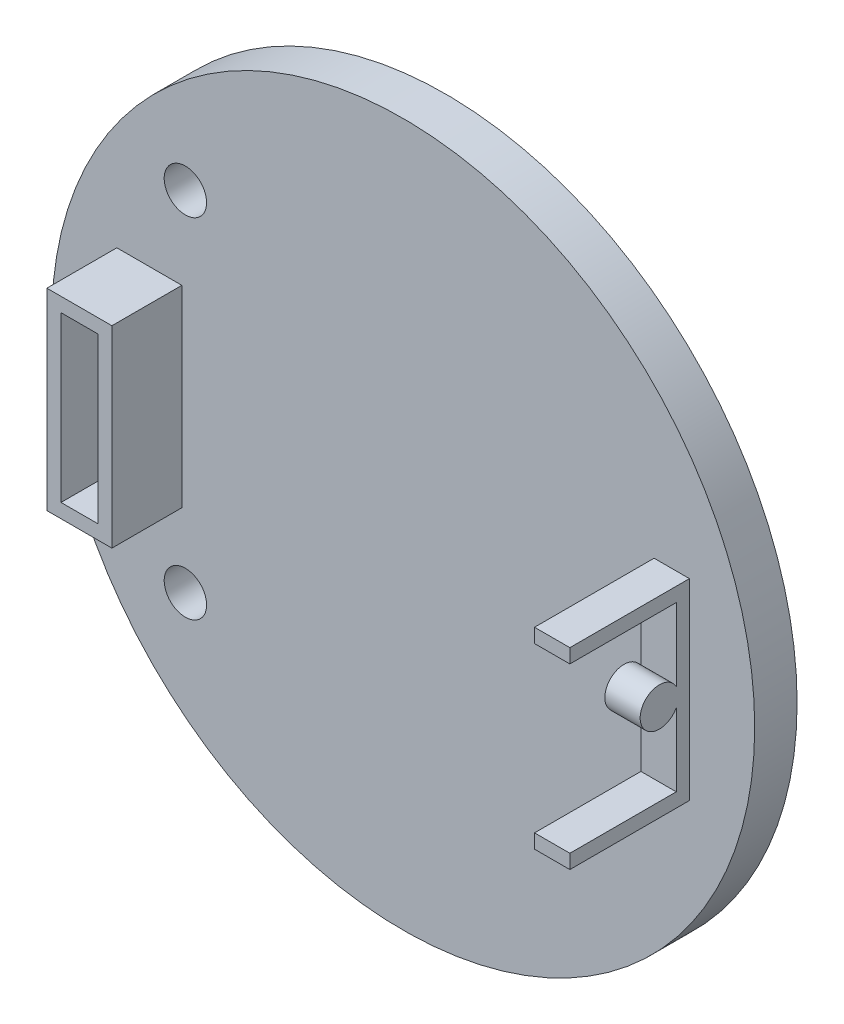
ISO-10303-21;
HEADER;
FILE_DESCRIPTION(('STEP AP214'),'2;1');
FILE_NAME('part.step','',(''),(''),'','','');
FILE_SCHEMA(('AUTOMOTIVE_DESIGN { 1 0 10303 214 1 1 1 1 }'));
ENDSEC;
DATA;
#1=APPLICATION_CONTEXT('core data for automotive mechanical design processes');
#2=APPLICATION_PROTOCOL_DEFINITION('international standard','automotive_design',2000,#1);
#3=PRODUCT_CONTEXT('',#1,'mechanical');
#4=PRODUCT('Part','Part','',(#3));
#5=PRODUCT_RELATED_PRODUCT_CATEGORY('part','',(#4));
#6=PRODUCT_DEFINITION_FORMATION('','',#4);
#7=PRODUCT_DEFINITION_CONTEXT('part definition',#1,'design');
#8=PRODUCT_DEFINITION('design','',#6,#7);
#9=PRODUCT_DEFINITION_SHAPE('','',#8);
#10=(LENGTH_UNIT() NAMED_UNIT(*) SI_UNIT(.MILLI.,.METRE.));
#11=(NAMED_UNIT(*) PLANE_ANGLE_UNIT() SI_UNIT($,.RADIAN.));
#12=(NAMED_UNIT(*) SI_UNIT($,.STERADIAN.) SOLID_ANGLE_UNIT());
#13=UNCERTAINTY_MEASURE_WITH_UNIT(LENGTH_MEASURE(1.E-05),#10,'distance_accuracy_value','');
#14=(GEOMETRIC_REPRESENTATION_CONTEXT(3) GLOBAL_UNCERTAINTY_ASSIGNED_CONTEXT((#13)) GLOBAL_UNIT_ASSIGNED_CONTEXT((#10,
#11,#12)) REPRESENTATION_CONTEXT('',''));
#15=CARTESIAN_POINT('',(0.,0.,0.));
#16=DIRECTION('',(0.,0.,1.));
#17=DIRECTION('',(1.,0.,0.));
#18=AXIS2_PLACEMENT_3D('',#15,#16,#17);
#19=CARTESIAN_POINT('',(0.,0.,0.));
#20=DIRECTION('',(0.,0.,1.));
#21=DIRECTION('',(1.,0.,0.));
#22=AXIS2_PLACEMENT_3D('',#19,#20,#21);
#23=PLANE('',#22);
#24=CARTESIAN_POINT('',(-15.4092069314207,12.7514449398056,0.));
#25=DIRECTION('',(0.,0.,1.));
#26=DIRECTION('',(1.,0.,0.));
#27=AXIS2_PLACEMENT_3D('',#24,#25,#26);
#28=CIRCLE('',#27,1.5);
#29=CARTESIAN_POINT('',(-13.9092069314207,12.7514449398056,0.));
#30=VERTEX_POINT('',#29);
#31=EDGE_CURVE('E358',#30,#30,#28,.T.);
#32=ORIENTED_EDGE('',*,*,#31,.F.);
#33=EDGE_LOOP('',(#32));
#34=FACE_BOUND('',#33,.T.);
#35=CARTESIAN_POINT('',(-15.4092069314207,-11.8993191986614,0.));
#36=DIRECTION('',(0.,0.,1.));
#37=DIRECTION('',(1.,0.,0.));
#38=AXIS2_PLACEMENT_3D('',#35,#36,#37);
#39=CIRCLE('',#38,1.5);
#40=CARTESIAN_POINT('',(-13.9092069314207,-11.8993191986614,0.));
#41=VERTEX_POINT('',#40);
#42=EDGE_CURVE('E365',#41,#41,#39,.T.);
#43=ORIENTED_EDGE('',*,*,#42,.F.);
#44=EDGE_LOOP('',(#43));
#45=FACE_BOUND('',#44,.T.);
#46=DIRECTION('',(1.,0.,0.));
#47=VECTOR('',#46,1.);
#48=CARTESIAN_POINT('',(17.755,6.8,0.));
#49=LINE('',#48,#47);
#50=CARTESIAN_POINT('',(17.755,6.8,0.));
#51=VERTEX_POINT('',#50);
#52=CARTESIAN_POINT('',(20.255,6.8,0.));
#53=VERTEX_POINT('',#52);
#54=EDGE_CURVE('E305',#51,#53,#49,.T.);
#55=ORIENTED_EDGE('',*,*,#54,.T.);
#56=DIRECTION('',(0.,-1.,0.));
#57=VECTOR('',#56,1.);
#58=CARTESIAN_POINT('',(20.255,6.8,0.));
#59=LINE('',#58,#57);
#60=CARTESIAN_POINT('',(20.255,-6.8,0.));
#61=VERTEX_POINT('',#60);
#62=EDGE_CURVE('E328',#53,#61,#59,.T.);
#63=ORIENTED_EDGE('',*,*,#62,.T.);
#64=DIRECTION('',(1.,0.,0.));
#65=VECTOR('',#64,1.);
#66=CARTESIAN_POINT('',(17.755,-6.8,0.));
#67=LINE('',#66,#65);
#68=CARTESIAN_POINT('',(17.755,-6.8,0.));
#69=VERTEX_POINT('',#68);
#70=EDGE_CURVE('E331',#69,#61,#67,.T.);
#71=ORIENTED_EDGE('',*,*,#70,.F.);
#72=DIRECTION('',(0.,-1.,0.));
#73=VECTOR('',#72,1.);
#74=CARTESIAN_POINT('',(17.755,6.8,0.));
#75=LINE('',#74,#73);
#76=EDGE_CURVE('E311',#51,#69,#75,.T.);
#77=ORIENTED_EDGE('',*,*,#76,.F.);
#78=EDGE_LOOP('',(#55,#63,#71,#77));
#79=FACE_BOUND('',#78,.T.);
#80=CARTESIAN_POINT('',(0.,0.,0.));
#81=DIRECTION('',(0.,0.,1.));
#82=DIRECTION('',(1.,0.,0.));
#83=AXIS2_PLACEMENT_3D('',#80,#81,#82);
#84=CIRCLE('',#83,24.875);
#85=CARTESIAN_POINT('',(24.875,0.,0.));
#86=VERTEX_POINT('',#85);
#87=EDGE_CURVE('E49',#86,#86,#84,.T.);
#88=ORIENTED_EDGE('',*,*,#87,.T.);
#89=EDGE_LOOP('',(#88));
#90=FACE_BOUND('',#89,.T.);
#91=DIRECTION('',(1.,0.,0.));
#92=VECTOR('',#91,1.);
#93=CARTESIAN_POINT('',(-20.26,-6.815,0.));
#94=LINE('',#93,#92);
#95=CARTESIAN_POINT('',(-20.26,-6.815,0.));
#96=VERTEX_POINT('',#95);
#97=CARTESIAN_POINT('',(-15.66,-6.815,0.));
#98=VERTEX_POINT('',#97);
#99=EDGE_CURVE('E225',#96,#98,#94,.T.);
#100=ORIENTED_EDGE('',*,*,#99,.F.);
#101=DIRECTION('',(0.,-1.,0.));
#102=VECTOR('',#101,1.);
#103=CARTESIAN_POINT('',(-20.26,6.815,0.));
#104=LINE('',#103,#102);
#105=CARTESIAN_POINT('',(-20.26,6.815,0.));
#106=VERTEX_POINT('',#105);
#107=EDGE_CURVE('E205',#106,#96,#104,.T.);
#108=ORIENTED_EDGE('',*,*,#107,.F.);
#109=DIRECTION('',(-1.,0.,0.));
#110=VECTOR('',#109,1.);
#111=CARTESIAN_POINT('',(-20.26,6.815,0.));
#112=LINE('',#111,#110);
#113=CARTESIAN_POINT('',(-15.66,6.815,0.));
#114=VERTEX_POINT('',#113);
#115=EDGE_CURVE('E212',#114,#106,#112,.T.);
#116=ORIENTED_EDGE('',*,*,#115,.F.);
#117=DIRECTION('',(0.,1.,0.));
#118=VECTOR('',#117,1.);
#119=CARTESIAN_POINT('',(-15.66,6.815,0.));
#120=LINE('',#119,#118);
#121=EDGE_CURVE('E228',#98,#114,#120,.T.);
#122=ORIENTED_EDGE('',*,*,#121,.F.);
#123=EDGE_LOOP('',(#100,#108,#116,#122));
#124=FACE_BOUND('',#123,.T.);
#125=ADVANCED_FACE('F39',(#34,#45,#79,#90,#124),#23,.T.);
#126=CARTESIAN_POINT('',(0.,0.,8.46));
#127=DIRECTION('',(0.,0.,-1.));
#128=DIRECTION('',(-1.,0.,0.));
#129=AXIS2_PLACEMENT_3D('',#126,#127,#128);
#130=PLANE('',#129);
#131=DIRECTION('',(1.,0.,0.));
#132=VECTOR('',#131,1.);
#133=CARTESIAN_POINT('',(3.92599913973473,-5.8,8.46));
#134=LINE('',#133,#132);
#135=CARTESIAN_POINT('',(17.755,-5.8,8.46));
#136=VERTEX_POINT('',#135);
#137=CARTESIAN_POINT('',(20.255,-5.8,8.46));
#138=VERTEX_POINT('',#137);
#139=EDGE_CURVE('E288',#136,#138,#134,.T.);
#140=ORIENTED_EDGE('',*,*,#139,.F.);
#141=DIRECTION('',(0.,-1.,0.));
#142=VECTOR('',#141,1.);
#143=CARTESIAN_POINT('',(17.755,6.8,8.46));
#144=LINE('',#143,#142);
#145=CARTESIAN_POINT('',(17.755,-6.8,8.46));
#146=VERTEX_POINT('',#145);
#147=EDGE_CURVE('E320',#136,#146,#144,.T.);
#148=ORIENTED_EDGE('',*,*,#147,.T.);
#149=DIRECTION('',(1.,0.,0.));
#150=VECTOR('',#149,1.);
#151=CARTESIAN_POINT('',(17.755,-6.8,8.46));
#152=LINE('',#151,#150);
#153=CARTESIAN_POINT('',(20.255,-6.8,8.46));
#154=VERTEX_POINT('',#153);
#155=EDGE_CURVE('E316',#146,#154,#152,.T.);
#156=ORIENTED_EDGE('',*,*,#155,.T.);
#157=DIRECTION('',(0.,-1.,0.));
#158=VECTOR('',#157,1.);
#159=CARTESIAN_POINT('',(20.255,6.8,8.46));
#160=LINE('',#159,#158);
#161=EDGE_CURVE('E310',#138,#154,#160,.T.);
#162=ORIENTED_EDGE('',*,*,#161,.F.);
#163=EDGE_LOOP('',(#140,#148,#156,#162));
#164=FACE_BOUND('',#163,.T.);
#165=ADVANCED_FACE('F402',(#164),#130,.F.);
#166=DIRECTION('',(1.,0.,0.));
#167=VECTOR('',#166,1.);
#168=CARTESIAN_POINT('',(3.92599913973473,5.8,8.46));
#169=LINE('',#168,#167);
#170=CARTESIAN_POINT('',(17.755,5.8,8.46));
#171=VERTEX_POINT('',#170);
#172=CARTESIAN_POINT('',(20.255,5.8,8.46));
#173=VERTEX_POINT('',#172);
#174=EDGE_CURVE('E291',#171,#173,#169,.T.);
#175=ORIENTED_EDGE('',*,*,#174,.T.);
#176=CARTESIAN_POINT('',(20.255,6.8,8.46));
#177=VERTEX_POINT('',#176);
#178=EDGE_CURVE('E312',#177,#173,#160,.T.);
#179=ORIENTED_EDGE('',*,*,#178,.F.);
#180=DIRECTION('',(1.,0.,0.));
#181=VECTOR('',#180,1.);
#182=CARTESIAN_POINT('',(17.755,6.8,8.46));
#183=LINE('',#182,#181);
#184=CARTESIAN_POINT('',(17.755,6.8,8.46));
#185=VERTEX_POINT('',#184);
#186=EDGE_CURVE('E306',#185,#177,#183,.T.);
#187=ORIENTED_EDGE('',*,*,#186,.F.);
#188=EDGE_CURVE('E321',#185,#171,#144,.T.);
#189=ORIENTED_EDGE('',*,*,#188,.T.);
#190=EDGE_LOOP('',(#175,#179,#187,#189));
#191=FACE_BOUND('',#190,.T.);
#192=ADVANCED_FACE('F397',(#191),#130,.F.);
#193=CARTESIAN_POINT('',(0.,0.,-3.));
#194=DIRECTION('',(0.,0.,1.));
#195=DIRECTION('',(1.,0.,0.));
#196=AXIS2_PLACEMENT_3D('',#193,#194,#195);
#197=CYLINDRICAL_SURFACE('',#196,24.875);
#198=CARTESIAN_POINT('',(0.,0.,-3.));
#199=DIRECTION('',(0.,0.,1.));
#200=DIRECTION('',(1.,0.,0.));
#201=AXIS2_PLACEMENT_3D('',#198,#199,#200);
#202=CIRCLE('',#201,24.875);
#203=CARTESIAN_POINT('',(24.875,0.,-3.));
#204=VERTEX_POINT('',#203);
#205=EDGE_CURVE('E11',#204,#204,#202,.T.);
#206=ORIENTED_EDGE('',*,*,#205,.T.);
#207=EDGE_LOOP('',(#206));
#208=FACE_BOUND('',#207,.T.);
#209=ORIENTED_EDGE('',*,*,#87,.F.);
#210=EDGE_LOOP('',(#209));
#211=FACE_BOUND('',#210,.T.);
#212=ADVANCED_FACE('F41',(#208,#211),#197,.T.);
#213=CARTESIAN_POINT('',(0.,0.,-3.));
#214=DIRECTION('',(0.,0.,1.));
#215=DIRECTION('',(1.,0.,0.));
#216=AXIS2_PLACEMENT_3D('',#213,#214,#215);
#217=PLANE('',#216);
#218=CARTESIAN_POINT('',(-15.4092069314207,12.7514449398056,-3.));
#219=DIRECTION('',(0.,0.,1.));
#220=DIRECTION('',(1.,0.,0.));
#221=AXIS2_PLACEMENT_3D('',#218,#219,#220);
#222=CIRCLE('',#221,1.5);
#223=CARTESIAN_POINT('',(-13.9092069314207,12.7514449398056,-3.));
#224=VERTEX_POINT('',#223);
#225=EDGE_CURVE('E43',#224,#224,#222,.T.);
#226=ORIENTED_EDGE('',*,*,#225,.T.);
#227=EDGE_LOOP('',(#226));
#228=FACE_BOUND('',#227,.T.);
#229=CARTESIAN_POINT('',(-15.4092069314207,-11.8993191986614,-3.));
#230=DIRECTION('',(0.,0.,1.));
#231=DIRECTION('',(1.,0.,0.));
#232=AXIS2_PLACEMENT_3D('',#229,#230,#231);
#233=CIRCLE('',#232,1.5);
#234=CARTESIAN_POINT('',(-13.9092069314207,-11.8993191986614,-3.));
#235=VERTEX_POINT('',#234);
#236=EDGE_CURVE('E355',#235,#235,#233,.T.);
#237=ORIENTED_EDGE('',*,*,#236,.T.);
#238=EDGE_LOOP('',(#237));
#239=FACE_BOUND('',#238,.T.);
#240=DIRECTION('',(1.,0.,0.));
#241=VECTOR('',#240,1.);
#242=CARTESIAN_POINT('',(-19.26,5.815,-3.));
#243=LINE('',#242,#241);
#244=CARTESIAN_POINT('',(-19.26,5.815,-3.));
#245=VERTEX_POINT('',#244);
#246=CARTESIAN_POINT('',(-16.66,5.815,-3.));
#247=VERTEX_POINT('',#246);
#248=EDGE_CURVE('E375',#245,#247,#243,.T.);
#249=ORIENTED_EDGE('',*,*,#248,.F.);
#250=DIRECTION('',(0.,1.,0.));
#251=VECTOR('',#250,1.);
#252=CARTESIAN_POINT('',(-19.26,5.815,-3.));
#253=LINE('',#252,#251);
#254=CARTESIAN_POINT('',(-19.26,-5.815,-3.));
#255=VERTEX_POINT('',#254);
#256=EDGE_CURVE('E206',#255,#245,#253,.T.);
#257=ORIENTED_EDGE('',*,*,#256,.F.);
#258=DIRECTION('',(-1.,0.,0.));
#259=VECTOR('',#258,1.);
#260=CARTESIAN_POINT('',(-19.26,-5.815,-3.));
#261=LINE('',#260,#259);
#262=CARTESIAN_POINT('',(-16.66,-5.815,-3.));
#263=VERTEX_POINT('',#262);
#264=EDGE_CURVE('E202',#263,#255,#261,.T.);
#265=ORIENTED_EDGE('',*,*,#264,.F.);
#266=DIRECTION('',(0.,-1.,0.));
#267=VECTOR('',#266,1.);
#268=CARTESIAN_POINT('',(-16.66,5.815,-3.));
#269=LINE('',#268,#267);
#270=EDGE_CURVE('E173',#247,#263,#269,.T.);
#271=ORIENTED_EDGE('',*,*,#270,.F.);
#272=EDGE_LOOP('',(#249,#257,#265,#271));
#273=FACE_BOUND('',#272,.T.);
#274=ORIENTED_EDGE('',*,*,#205,.F.);
#275=EDGE_LOOP('',(#274));
#276=FACE_BOUND('',#275,.T.);
#277=ADVANCED_FACE('F387',(#228,#239,#273,#276),#217,.F.);
#278=CARTESIAN_POINT('',(17.755,6.8,8.46));
#279=DIRECTION('',(0.,1.,0.));
#280=DIRECTION('',(-1.,0.,0.));
#281=AXIS2_PLACEMENT_3D('',#278,#279,#280);
#282=PLANE('',#281);
#283=ORIENTED_EDGE('',*,*,#54,.F.);
#284=DIRECTION('',(0.,0.,-1.));
#285=VECTOR('',#284,1.);
#286=CARTESIAN_POINT('',(17.755,6.8,8.46));
#287=LINE('',#286,#285);
#288=EDGE_CURVE('E338',#185,#51,#287,.T.);
#289=ORIENTED_EDGE('',*,*,#288,.F.);
#290=ORIENTED_EDGE('',*,*,#186,.T.);
#291=DIRECTION('',(0.,0.,-1.));
#292=VECTOR('',#291,1.);
#293=CARTESIAN_POINT('',(20.255,6.8,8.46));
#294=LINE('',#293,#292);
#295=EDGE_CURVE('E325',#177,#53,#294,.T.);
#296=ORIENTED_EDGE('',*,*,#295,.T.);
#297=EDGE_LOOP('',(#283,#289,#290,#296));
#298=FACE_BOUND('',#297,.T.);
#299=ADVANCED_FACE('F390',(#298),#282,.T.);
#300=CARTESIAN_POINT('',(17.755,6.8,8.46));
#301=DIRECTION('',(1.,0.,0.));
#302=DIRECTION('',(0.,1.,0.));
#303=AXIS2_PLACEMENT_3D('',#300,#301,#302);
#304=PLANE('',#303);
#305=DIRECTION('',(0.,0.,-1.));
#306=VECTOR('',#305,1.);
#307=CARTESIAN_POINT('',(17.755,-5.8,0.));
#308=LINE('',#307,#306);
#309=CARTESIAN_POINT('',(17.755,-5.8,0.931303911485231));
#310=VERTEX_POINT('',#309);
#311=EDGE_CURVE('E257',#136,#310,#308,.T.);
#312=ORIENTED_EDGE('',*,*,#311,.T.);
#313=DIRECTION('',(0.,1.,0.));
#314=VECTOR('',#313,1.);
#315=CARTESIAN_POINT('',(17.755,0.,0.931303911485232));
#316=LINE('',#315,#314);
#317=CARTESIAN_POINT('',(17.755,-0.649999999999997,0.931303911485233));
#318=VERTEX_POINT('',#317);
#319=EDGE_CURVE('E261',#310,#318,#316,.T.);
#320=ORIENTED_EDGE('',*,*,#319,.T.);
#321=CARTESIAN_POINT('',(17.755,0.,2.12591681950188));
#322=DIRECTION('',(1.,0.,0.));
#323=DIRECTION('',(0.,1.,0.));
#324=AXIS2_PLACEMENT_3D('',#321,#322,#323);
#325=CIRCLE('',#324,1.36);
#326=CARTESIAN_POINT('',(17.755,0.650000000000004,0.931303911485232));
#327=VERTEX_POINT('',#326);
#328=EDGE_CURVE('E265',#327,#318,#325,.T.);
#329=ORIENTED_EDGE('',*,*,#328,.F.);
#330=DIRECTION('',(0.,1.,0.));
#331=VECTOR('',#330,1.);
#332=CARTESIAN_POINT('',(17.755,0.,0.931303911485232));
#333=LINE('',#332,#331);
#334=CARTESIAN_POINT('',(17.755,5.8,0.931303911485232));
#335=VERTEX_POINT('',#334);
#336=EDGE_CURVE('E248',#327,#335,#333,.T.);
#337=ORIENTED_EDGE('',*,*,#336,.T.);
#338=DIRECTION('',(0.,0.,1.));
#339=VECTOR('',#338,1.);
#340=CARTESIAN_POINT('',(17.755,5.8,0.));
#341=LINE('',#340,#339);
#342=EDGE_CURVE('E252',#335,#171,#341,.T.);
#343=ORIENTED_EDGE('',*,*,#342,.T.);
#344=ORIENTED_EDGE('',*,*,#188,.F.);
#345=ORIENTED_EDGE('',*,*,#288,.T.);
#346=ORIENTED_EDGE('',*,*,#76,.T.);
#347=DIRECTION('',(0.,0.,-1.));
#348=VECTOR('',#347,1.);
#349=CARTESIAN_POINT('',(17.755,-6.8,8.46));
#350=LINE('',#349,#348);
#351=EDGE_CURVE('E342',#146,#69,#350,.T.);
#352=ORIENTED_EDGE('',*,*,#351,.F.);
#353=ORIENTED_EDGE('',*,*,#147,.F.);
#354=EDGE_LOOP('',(#312,#320,#329,#337,#343,#344,#345,#346,#352,#353));
#355=FACE_BOUND('',#354,.T.);
#356=ADVANCED_FACE('F461',(#355),#304,.F.);
#357=CARTESIAN_POINT('',(17.755,-6.8,8.46));
#358=DIRECTION('',(0.,1.,0.));
#359=DIRECTION('',(-1.,0.,0.));
#360=AXIS2_PLACEMENT_3D('',#357,#358,#359);
#361=PLANE('',#360);
#362=ORIENTED_EDGE('',*,*,#70,.T.);
#363=DIRECTION('',(0.,0.,-1.));
#364=VECTOR('',#363,1.);
#365=CARTESIAN_POINT('',(20.255,-6.8,8.46));
#366=LINE('',#365,#364);
#367=EDGE_CURVE('E346',#154,#61,#366,.T.);
#368=ORIENTED_EDGE('',*,*,#367,.F.);
#369=ORIENTED_EDGE('',*,*,#155,.F.);
#370=ORIENTED_EDGE('',*,*,#351,.T.);
#371=EDGE_LOOP('',(#362,#368,#369,#370));
#372=FACE_BOUND('',#371,.T.);
#373=ADVANCED_FACE('F464',(#372),#361,.F.);
#374=CARTESIAN_POINT('',(20.255,6.8,8.46));
#375=DIRECTION('',(1.,0.,0.));
#376=DIRECTION('',(0.,1.,0.));
#377=AXIS2_PLACEMENT_3D('',#374,#375,#376);
#378=PLANE('',#377);
#379=DIRECTION('',(0.,-1.,0.));
#380=VECTOR('',#379,1.);
#381=CARTESIAN_POINT('',(20.255,0.,0.931303911485232));
#382=LINE('',#381,#380);
#383=CARTESIAN_POINT('',(20.255,-0.649999999999995,0.931303911485232));
#384=VERTEX_POINT('',#383);
#385=CARTESIAN_POINT('',(20.255,-5.8,0.931303911485231));
#386=VERTEX_POINT('',#385);
#387=EDGE_CURVE('E247',#384,#386,#382,.T.);
#388=ORIENTED_EDGE('',*,*,#387,.T.);
#389=DIRECTION('',(0.,0.,1.));
#390=VECTOR('',#389,1.);
#391=CARTESIAN_POINT('',(20.255,-5.8,0.));
#392=LINE('',#391,#390);
#393=EDGE_CURVE('E281',#386,#138,#392,.T.);
#394=ORIENTED_EDGE('',*,*,#393,.T.);
#395=ORIENTED_EDGE('',*,*,#161,.T.);
#396=ORIENTED_EDGE('',*,*,#367,.T.);
#397=ORIENTED_EDGE('',*,*,#62,.F.);
#398=ORIENTED_EDGE('',*,*,#295,.F.);
#399=ORIENTED_EDGE('',*,*,#178,.T.);
#400=DIRECTION('',(0.,0.,-1.));
#401=VECTOR('',#400,1.);
#402=CARTESIAN_POINT('',(20.255,5.8,0.));
#403=LINE('',#402,#401);
#404=CARTESIAN_POINT('',(20.255,5.8,0.931303911485232));
#405=VERTEX_POINT('',#404);
#406=EDGE_CURVE('E277',#173,#405,#403,.T.);
#407=ORIENTED_EDGE('',*,*,#406,.T.);
#408=DIRECTION('',(0.,-1.,0.));
#409=VECTOR('',#408,1.);
#410=CARTESIAN_POINT('',(20.255,0.,0.931303911485232));
#411=LINE('',#410,#409);
#412=CARTESIAN_POINT('',(20.255,0.650000000000005,0.931303911485232));
#413=VERTEX_POINT('',#412);
#414=EDGE_CURVE('E273',#405,#413,#411,.T.);
#415=ORIENTED_EDGE('',*,*,#414,.T.);
#416=CARTESIAN_POINT('',(20.255,0.,2.12591681950188));
#417=DIRECTION('',(1.,0.,0.));
#418=DIRECTION('',(0.,1.,0.));
#419=AXIS2_PLACEMENT_3D('',#416,#417,#418);
#420=CIRCLE('',#419,1.36);
#421=EDGE_CURVE('E269',#384,#413,#420,.F.);
#422=ORIENTED_EDGE('',*,*,#421,.F.);
#423=EDGE_LOOP('',(#388,#394,#395,#396,#397,#398,#399,#407,#415,#422));
#424=FACE_BOUND('',#423,.T.);
#425=ADVANCED_FACE('F456',(#424),#378,.T.);
#426=CARTESIAN_POINT('',(3.92599913973473,0.,0.931303911485232));
#427=DIRECTION('',(0.,0.,1.));
#428=DIRECTION('',(0.,-1.,0.));
#429=AXIS2_PLACEMENT_3D('',#426,#427,#428);
#430=PLANE('',#429);
#431=DIRECTION('',(1.,0.,0.));
#432=VECTOR('',#431,1.);
#433=CARTESIAN_POINT('',(3.92599913973473,-5.8,0.931303911485231));
#434=LINE('',#433,#432);
#435=EDGE_CURVE('E253',#310,#386,#434,.T.);
#436=ORIENTED_EDGE('',*,*,#435,.T.);
#437=ORIENTED_EDGE('',*,*,#387,.F.);
#438=DIRECTION('',(1.,0.,0.));
#439=VECTOR('',#438,1.);
#440=CARTESIAN_POINT('',(3.92599913973473,-0.65,0.931303911485232));
#441=LINE('',#440,#439);
#442=EDGE_CURVE('E285',#318,#384,#441,.T.);
#443=ORIENTED_EDGE('',*,*,#442,.F.);
#444=ORIENTED_EDGE('',*,*,#319,.F.);
#445=EDGE_LOOP('',(#436,#437,#443,#444));
#446=FACE_BOUND('',#445,.T.);
#447=ADVANCED_FACE('F442',(#446),#430,.T.);
#448=CARTESIAN_POINT('',(3.92599913973473,-5.8,0.));
#449=DIRECTION('',(0.,1.,0.));
#450=DIRECTION('',(-1.,0.,0.));
#451=AXIS2_PLACEMENT_3D('',#448,#449,#450);
#452=PLANE('',#451);
#453=ORIENTED_EDGE('',*,*,#139,.T.);
#454=ORIENTED_EDGE('',*,*,#393,.F.);
#455=ORIENTED_EDGE('',*,*,#435,.F.);
#456=ORIENTED_EDGE('',*,*,#311,.F.);
#457=EDGE_LOOP('',(#453,#454,#455,#456));
#458=FACE_BOUND('',#457,.T.);
#459=ADVANCED_FACE('F438',(#458),#452,.T.);
#460=CARTESIAN_POINT('',(3.92599913973473,5.8,0.));
#461=DIRECTION('',(0.,-1.,0.));
#462=DIRECTION('',(1.,0.,0.));
#463=AXIS2_PLACEMENT_3D('',#460,#461,#462);
#464=PLANE('',#463);
#465=DIRECTION('',(1.,0.,0.));
#466=VECTOR('',#465,1.);
#467=CARTESIAN_POINT('',(3.92599913973473,5.8,0.931303911485232));
#468=LINE('',#467,#466);
#469=EDGE_CURVE('E295',#335,#405,#468,.T.);
#470=ORIENTED_EDGE('',*,*,#469,.T.);
#471=ORIENTED_EDGE('',*,*,#406,.F.);
#472=ORIENTED_EDGE('',*,*,#174,.F.);
#473=ORIENTED_EDGE('',*,*,#342,.F.);
#474=EDGE_LOOP('',(#470,#471,#472,#473));
#475=FACE_BOUND('',#474,.T.);
#476=ADVANCED_FACE('F441',(#475),#464,.T.);
#477=CARTESIAN_POINT('',(3.92599913973473,0.,0.931303911485232));
#478=DIRECTION('',(0.,0.,1.));
#479=DIRECTION('',(0.,-1.,0.));
#480=AXIS2_PLACEMENT_3D('',#477,#478,#479);
#481=PLANE('',#480);
#482=DIRECTION('',(1.,0.,0.));
#483=VECTOR('',#482,1.);
#484=CARTESIAN_POINT('',(3.92599913973473,0.65,0.931303911485232));
#485=LINE('',#484,#483);
#486=EDGE_CURVE('E298',#327,#413,#485,.T.);
#487=ORIENTED_EDGE('',*,*,#486,.T.);
#488=ORIENTED_EDGE('',*,*,#414,.F.);
#489=ORIENTED_EDGE('',*,*,#469,.F.);
#490=ORIENTED_EDGE('',*,*,#336,.F.);
#491=EDGE_LOOP('',(#487,#488,#489,#490));
#492=FACE_BOUND('',#491,.T.);
#493=ADVANCED_FACE('F446',(#492),#481,.T.);
#494=CARTESIAN_POINT('',(3.92599913973473,0.,2.12591681950188));
#495=DIRECTION('',(1.,0.,0.));
#496=DIRECTION('',(0.,1.,0.));
#497=AXIS2_PLACEMENT_3D('',#494,#495,#496);
#498=CYLINDRICAL_SURFACE('',#497,1.36);
#499=ORIENTED_EDGE('',*,*,#328,.T.);
#500=ORIENTED_EDGE('',*,*,#442,.T.);
#501=ORIENTED_EDGE('',*,*,#421,.T.);
#502=ORIENTED_EDGE('',*,*,#486,.F.);
#503=EDGE_LOOP('',(#499,#500,#501,#502));
#504=FACE_BOUND('',#503,.T.);
#505=ADVANCED_FACE('F437',(#504),#498,.T.);
#506=CARTESIAN_POINT('',(-20.26,6.815,4.95));
#507=DIRECTION('',(1.,0.,0.));
#508=DIRECTION('',(0.,1.,0.));
#509=AXIS2_PLACEMENT_3D('',#506,#507,#508);
#510=PLANE('',#509);
#511=ORIENTED_EDGE('',*,*,#107,.T.);
#512=DIRECTION('',(0.,0.,-1.));
#513=VECTOR('',#512,1.);
#514=CARTESIAN_POINT('',(-20.26,-6.815,4.95));
#515=LINE('',#514,#513);
#516=CARTESIAN_POINT('',(-20.26,-6.815,4.95));
#517=VERTEX_POINT('',#516);
#518=EDGE_CURVE('E244',#517,#96,#515,.T.);
#519=ORIENTED_EDGE('',*,*,#518,.F.);
#520=DIRECTION('',(0.,-1.,0.));
#521=VECTOR('',#520,1.);
#522=CARTESIAN_POINT('',(-20.26,6.815,4.95));
#523=LINE('',#522,#521);
#524=CARTESIAN_POINT('',(-20.26,6.815,4.95));
#525=VERTEX_POINT('',#524);
#526=EDGE_CURVE('E207',#525,#517,#523,.T.);
#527=ORIENTED_EDGE('',*,*,#526,.F.);
#528=DIRECTION('',(0.,0.,-1.));
#529=VECTOR('',#528,1.);
#530=CARTESIAN_POINT('',(-20.26,6.815,4.95));
#531=LINE('',#530,#529);
#532=EDGE_CURVE('E221',#525,#106,#531,.T.);
#533=ORIENTED_EDGE('',*,*,#532,.T.);
#534=EDGE_LOOP('',(#511,#519,#527,#533));
#535=FACE_BOUND('',#534,.T.);
#536=ADVANCED_FACE('F420',(#535),#510,.F.);
#537=CARTESIAN_POINT('',(-20.26,-6.815,4.95));
#538=DIRECTION('',(0.,1.,0.));
#539=DIRECTION('',(0.,0.,1.));
#540=AXIS2_PLACEMENT_3D('',#537,#538,#539);
#541=PLANE('',#540);
#542=ORIENTED_EDGE('',*,*,#99,.T.);
#543=DIRECTION('',(0.,0.,-1.));
#544=VECTOR('',#543,1.);
#545=CARTESIAN_POINT('',(-15.66,-6.815,4.95));
#546=LINE('',#545,#544);
#547=CARTESIAN_POINT('',(-15.66,-6.815,4.95));
#548=VERTEX_POINT('',#547);
#549=EDGE_CURVE('E240',#548,#98,#546,.T.);
#550=ORIENTED_EDGE('',*,*,#549,.F.);
#551=DIRECTION('',(1.,0.,0.));
#552=VECTOR('',#551,1.);
#553=CARTESIAN_POINT('',(-20.26,-6.815,4.95));
#554=LINE('',#553,#552);
#555=EDGE_CURVE('E211',#517,#548,#554,.T.);
#556=ORIENTED_EDGE('',*,*,#555,.F.);
#557=ORIENTED_EDGE('',*,*,#518,.T.);
#558=EDGE_LOOP('',(#542,#550,#556,#557));
#559=FACE_BOUND('',#558,.T.);
#560=ADVANCED_FACE('F410',(#559),#541,.F.);
#561=CARTESIAN_POINT('',(-15.66,6.815,4.95));
#562=DIRECTION('',(-1.,0.,0.));
#563=DIRECTION('',(0.,0.,1.));
#564=AXIS2_PLACEMENT_3D('',#561,#562,#563);
#565=PLANE('',#564);
#566=ORIENTED_EDGE('',*,*,#121,.T.);
#567=DIRECTION('',(0.,0.,-1.));
#568=VECTOR('',#567,1.);
#569=CARTESIAN_POINT('',(-15.66,6.815,4.95));
#570=LINE('',#569,#568);
#571=CARTESIAN_POINT('',(-15.66,6.815,4.95));
#572=VERTEX_POINT('',#571);
#573=EDGE_CURVE('E237',#572,#114,#570,.T.);
#574=ORIENTED_EDGE('',*,*,#573,.F.);
#575=DIRECTION('',(0.,1.,0.));
#576=VECTOR('',#575,1.);
#577=CARTESIAN_POINT('',(-15.66,6.815,4.95));
#578=LINE('',#577,#576);
#579=EDGE_CURVE('E215',#548,#572,#578,.T.);
#580=ORIENTED_EDGE('',*,*,#579,.F.);
#581=ORIENTED_EDGE('',*,*,#549,.T.);
#582=EDGE_LOOP('',(#566,#574,#580,#581));
#583=FACE_BOUND('',#582,.T.);
#584=ADVANCED_FACE('F414',(#583),#565,.F.);
#585=CARTESIAN_POINT('',(-20.26,6.815,4.95));
#586=DIRECTION('',(0.,-1.,0.));
#587=DIRECTION('',(1.,0.,0.));
#588=AXIS2_PLACEMENT_3D('',#585,#586,#587);
#589=PLANE('',#588);
#590=ORIENTED_EDGE('',*,*,#115,.T.);
#591=ORIENTED_EDGE('',*,*,#532,.F.);
#592=DIRECTION('',(-1.,0.,0.));
#593=VECTOR('',#592,1.);
#594=CARTESIAN_POINT('',(-20.26,6.815,4.95));
#595=LINE('',#594,#593);
#596=EDGE_CURVE('E218',#572,#525,#595,.T.);
#597=ORIENTED_EDGE('',*,*,#596,.F.);
#598=ORIENTED_EDGE('',*,*,#573,.T.);
#599=EDGE_LOOP('',(#590,#591,#597,#598));
#600=FACE_BOUND('',#599,.T.);
#601=ADVANCED_FACE('F422',(#600),#589,.F.);
#602=CARTESIAN_POINT('',(0.,0.,4.95));
#603=DIRECTION('',(0.,0.,1.));
#604=DIRECTION('',(1.,0.,0.));
#605=AXIS2_PLACEMENT_3D('',#602,#603,#604);
#606=PLANE('',#605);
#607=DIRECTION('',(0.,-1.,0.));
#608=VECTOR('',#607,1.);
#609=CARTESIAN_POINT('',(-19.26,5.815,4.95));
#610=LINE('',#609,#608);
#611=CARTESIAN_POINT('',(-19.26,5.815,4.95));
#612=VERTEX_POINT('',#611);
#613=CARTESIAN_POINT('',(-19.26,-5.815,4.95));
#614=VERTEX_POINT('',#613);
#615=EDGE_CURVE('E65',#612,#614,#610,.T.);
#616=ORIENTED_EDGE('',*,*,#615,.F.);
#617=DIRECTION('',(-1.,0.,0.));
#618=VECTOR('',#617,1.);
#619=CARTESIAN_POINT('',(-19.26,5.815,4.95));
#620=LINE('',#619,#618);
#621=CARTESIAN_POINT('',(-16.66,5.815,4.95));
#622=VERTEX_POINT('',#621);
#623=EDGE_CURVE('E188',#622,#612,#620,.T.);
#624=ORIENTED_EDGE('',*,*,#623,.F.);
#625=DIRECTION('',(0.,1.,0.));
#626=VECTOR('',#625,1.);
#627=CARTESIAN_POINT('',(-16.66,5.815,4.95));
#628=LINE('',#627,#626);
#629=CARTESIAN_POINT('',(-16.66,-5.815,4.95));
#630=VERTEX_POINT('',#629);
#631=EDGE_CURVE('E170',#630,#622,#628,.T.);
#632=ORIENTED_EDGE('',*,*,#631,.F.);
#633=DIRECTION('',(1.,0.,0.));
#634=VECTOR('',#633,1.);
#635=CARTESIAN_POINT('',(-19.26,-5.815,4.95));
#636=LINE('',#635,#634);
#637=EDGE_CURVE('E180',#614,#630,#636,.T.);
#638=ORIENTED_EDGE('',*,*,#637,.F.);
#639=EDGE_LOOP('',(#616,#624,#632,#638));
#640=FACE_BOUND('',#639,.T.);
#641=ORIENTED_EDGE('',*,*,#526,.T.);
#642=ORIENTED_EDGE('',*,*,#555,.T.);
#643=ORIENTED_EDGE('',*,*,#579,.T.);
#644=ORIENTED_EDGE('',*,*,#596,.T.);
#645=EDGE_LOOP('',(#641,#642,#643,#644));
#646=FACE_BOUND('',#645,.T.);
#647=ADVANCED_FACE('F185',(#640,#646),#606,.T.);
#648=CARTESIAN_POINT('',(-19.26,5.815,-14.9170843749635));
#649=DIRECTION('',(-1.,0.,0.));
#650=DIRECTION('',(0.,0.,1.));
#651=AXIS2_PLACEMENT_3D('',#648,#649,#650);
#652=PLANE('',#651);
#653=ORIENTED_EDGE('',*,*,#256,.T.);
#654=DIRECTION('',(0.,0.,1.));
#655=VECTOR('',#654,1.);
#656=CARTESIAN_POINT('',(-19.26,5.815,-14.9170843749635));
#657=LINE('',#656,#655);
#658=EDGE_CURVE('E195',#245,#612,#657,.T.);
#659=ORIENTED_EDGE('',*,*,#658,.T.);
#660=ORIENTED_EDGE('',*,*,#615,.T.);
#661=DIRECTION('',(0.,0.,1.));
#662=VECTOR('',#661,1.);
#663=CARTESIAN_POINT('',(-19.26,-5.815,-14.9170843749635));
#664=LINE('',#663,#662);
#665=EDGE_CURVE('E177',#255,#614,#664,.T.);
#666=ORIENTED_EDGE('',*,*,#665,.F.);
#667=EDGE_LOOP('',(#653,#659,#660,#666));
#668=FACE_BOUND('',#667,.T.);
#669=ADVANCED_FACE('F382',(#668),#652,.F.);
#670=CARTESIAN_POINT('',(-19.26,5.815,-14.9170843749635));
#671=DIRECTION('',(0.,1.,0.));
#672=DIRECTION('',(0.,0.,1.));
#673=AXIS2_PLACEMENT_3D('',#670,#671,#672);
#674=PLANE('',#673);
#675=ORIENTED_EDGE('',*,*,#248,.T.);
#676=DIRECTION('',(0.,0.,1.));
#677=VECTOR('',#676,1.);
#678=CARTESIAN_POINT('',(-16.66,5.815,-14.9170843749635));
#679=LINE('',#678,#677);
#680=EDGE_CURVE('E176',#247,#622,#679,.T.);
#681=ORIENTED_EDGE('',*,*,#680,.T.);
#682=ORIENTED_EDGE('',*,*,#623,.T.);
#683=ORIENTED_EDGE('',*,*,#658,.F.);
#684=EDGE_LOOP('',(#675,#681,#682,#683));
#685=FACE_BOUND('',#684,.T.);
#686=ADVANCED_FACE('F386',(#685),#674,.F.);
#687=CARTESIAN_POINT('',(-16.66,5.815,-14.9170843749635));
#688=DIRECTION('',(1.,0.,0.));
#689=DIRECTION('',(0.,0.,-1.));
#690=AXIS2_PLACEMENT_3D('',#687,#688,#689);
#691=PLANE('',#690);
#692=ORIENTED_EDGE('',*,*,#270,.T.);
#693=DIRECTION('',(0.,0.,1.));
#694=VECTOR('',#693,1.);
#695=CARTESIAN_POINT('',(-16.66,-5.815,-14.9170843749635));
#696=LINE('',#695,#694);
#697=EDGE_CURVE('E57',#263,#630,#696,.T.);
#698=ORIENTED_EDGE('',*,*,#697,.T.);
#699=ORIENTED_EDGE('',*,*,#631,.T.);
#700=ORIENTED_EDGE('',*,*,#680,.F.);
#701=EDGE_LOOP('',(#692,#698,#699,#700));
#702=FACE_BOUND('',#701,.T.);
#703=ADVANCED_FACE('F167',(#702),#691,.F.);
#704=CARTESIAN_POINT('',(-19.26,-5.815,-14.9170843749635));
#705=DIRECTION('',(0.,-1.,0.));
#706=DIRECTION('',(0.,0.,-1.));
#707=AXIS2_PLACEMENT_3D('',#704,#705,#706);
#708=PLANE('',#707);
#709=ORIENTED_EDGE('',*,*,#264,.T.);
#710=ORIENTED_EDGE('',*,*,#665,.T.);
#711=ORIENTED_EDGE('',*,*,#637,.T.);
#712=ORIENTED_EDGE('',*,*,#697,.F.);
#713=EDGE_LOOP('',(#709,#710,#711,#712));
#714=FACE_BOUND('',#713,.T.);
#715=ADVANCED_FACE('F181',(#714),#708,.F.);
#716=CARTESIAN_POINT('',(-15.4092069314207,-11.8993191986614,-4.95));
#717=DIRECTION('',(0.,0.,1.));
#718=DIRECTION('',(1.,0.,0.));
#719=AXIS2_PLACEMENT_3D('',#716,#717,#718);
#720=CYLINDRICAL_SURFACE('',#719,1.5);
#721=CARTESIAN_POINT('',(-13.9092069314207,-11.8993191986614,0.));
#722=CARTESIAN_POINT('',(-13.9092069314207,-11.8993191986614,-0.03125));
#723=CARTESIAN_POINT('',(-13.9092069314207,-11.8993191986614,-0.0625000000000001));
#724=CARTESIAN_POINT('',(-13.9092069314207,-11.8993191986614,-0.125));
#725=CARTESIAN_POINT('',(-13.9092069314207,-11.8993191986614,-0.15625));
#726=CARTESIAN_POINT('',(-13.9092069314207,-11.8993191986614,-0.21875));
#727=CARTESIAN_POINT('',(-13.9092069314207,-11.8993191986614,-0.25));
#728=CARTESIAN_POINT('',(-13.9092069314207,-11.8993191986614,-0.3125));
#729=CARTESIAN_POINT('',(-13.9092069314207,-11.8993191986614,-0.34375));
#730=CARTESIAN_POINT('',(-13.9092069314207,-11.8993191986614,-0.40625));
#731=CARTESIAN_POINT('',(-13.9092069314207,-11.8993191986614,-0.4375));
#732=CARTESIAN_POINT('',(-13.9092069314207,-11.8993191986614,-0.5));
#733=CARTESIAN_POINT('',(-13.9092069314207,-11.8993191986614,-0.53125));
#734=CARTESIAN_POINT('',(-13.9092069314207,-11.8993191986614,-0.593750000000001));
#735=CARTESIAN_POINT('',(-13.9092069314207,-11.8993191986614,-0.625000000000001));
#736=CARTESIAN_POINT('',(-13.9092069314207,-11.8993191986614,-0.687500000000001));
#737=CARTESIAN_POINT('',(-13.9092069314207,-11.8993191986614,-0.718750000000001));
#738=CARTESIAN_POINT('',(-13.9092069314207,-11.8993191986614,-0.781250000000001));
#739=CARTESIAN_POINT('',(-13.9092069314207,-11.8993191986614,-0.812500000000001));
#740=CARTESIAN_POINT('',(-13.9092069314207,-11.8993191986614,-0.875));
#741=CARTESIAN_POINT('',(-13.9092069314207,-11.8993191986614,-0.90625));
#742=CARTESIAN_POINT('',(-13.9092069314207,-11.8993191986614,-0.96875));
#743=CARTESIAN_POINT('',(-13.9092069314207,-11.8993191986614,-1.));
#744=CARTESIAN_POINT('',(-13.9092069314207,-11.8993191986614,-1.0625));
#745=CARTESIAN_POINT('',(-13.9092069314207,-11.8993191986614,-1.09375));
#746=CARTESIAN_POINT('',(-13.9092069314207,-11.8993191986614,-1.15625));
#747=CARTESIAN_POINT('',(-13.9092069314207,-11.8993191986614,-1.1875));
#748=CARTESIAN_POINT('',(-13.9092069314207,-11.8993191986614,-1.25));
#749=CARTESIAN_POINT('',(-13.9092069314207,-11.8993191986614,-1.28125));
#750=CARTESIAN_POINT('',(-13.9092069314207,-11.8993191986614,-1.34375));
#751=CARTESIAN_POINT('',(-13.9092069314207,-11.8993191986614,-1.375));
#752=CARTESIAN_POINT('',(-13.9092069314207,-11.8993191986614,-1.4375));
#753=CARTESIAN_POINT('',(-13.9092069314207,-11.8993191986614,-1.46875));
#754=CARTESIAN_POINT('',(-13.9092069314207,-11.8993191986614,-1.53125));
#755=CARTESIAN_POINT('',(-13.9092069314207,-11.8993191986614,-1.5625));
#756=CARTESIAN_POINT('',(-13.9092069314207,-11.8993191986614,-1.625));
#757=CARTESIAN_POINT('',(-13.9092069314207,-11.8993191986614,-1.65625));
#758=CARTESIAN_POINT('',(-13.9092069314207,-11.8993191986614,-1.71875));
#759=CARTESIAN_POINT('',(-13.9092069314207,-11.8993191986614,-1.75));
#760=CARTESIAN_POINT('',(-13.9092069314207,-11.8993191986614,-1.8125));
#761=CARTESIAN_POINT('',(-13.9092069314207,-11.8993191986614,-1.84375));
#762=CARTESIAN_POINT('',(-13.9092069314207,-11.8993191986614,-1.90625));
#763=CARTESIAN_POINT('',(-13.9092069314207,-11.8993191986614,-1.9375));
#764=CARTESIAN_POINT('',(-13.9092069314207,-11.8993191986614,-2.));
#765=CARTESIAN_POINT('',(-13.9092069314207,-11.8993191986614,-2.03125));
#766=CARTESIAN_POINT('',(-13.9092069314207,-11.8993191986614,-2.09375));
#767=CARTESIAN_POINT('',(-13.9092069314207,-11.8993191986614,-2.125));
#768=CARTESIAN_POINT('',(-13.9092069314207,-11.8993191986614,-2.1875));
#769=CARTESIAN_POINT('',(-13.9092069314207,-11.8993191986614,-2.21875));
#770=CARTESIAN_POINT('',(-13.9092069314207,-11.8993191986614,-2.28125));
#771=CARTESIAN_POINT('',(-13.9092069314207,-11.8993191986614,-2.3125));
#772=CARTESIAN_POINT('',(-13.9092069314207,-11.8993191986614,-2.375));
#773=CARTESIAN_POINT('',(-13.9092069314207,-11.8993191986614,-2.40625));
#774=CARTESIAN_POINT('',(-13.9092069314207,-11.8993191986614,-2.46875));
#775=CARTESIAN_POINT('',(-13.9092069314207,-11.8993191986614,-2.5));
#776=CARTESIAN_POINT('',(-13.9092069314207,-11.8993191986614,-2.5625));
#777=CARTESIAN_POINT('',(-13.9092069314207,-11.8993191986614,-2.59375));
#778=CARTESIAN_POINT('',(-13.9092069314207,-11.8993191986614,-2.65625));
#779=CARTESIAN_POINT('',(-13.9092069314207,-11.8993191986614,-2.6875));
#780=CARTESIAN_POINT('',(-13.9092069314207,-11.8993191986614,-2.75));
#781=CARTESIAN_POINT('',(-13.9092069314207,-11.8993191986614,-2.78125));
#782=CARTESIAN_POINT('',(-13.9092069314207,-11.8993191986614,-2.84375));
#783=CARTESIAN_POINT('',(-13.9092069314207,-11.8993191986614,-2.875));
#784=CARTESIAN_POINT('',(-13.9092069314207,-11.8993191986614,-2.9375));
#785=CARTESIAN_POINT('',(-13.9092069314207,-11.8993191986614,-2.96875));
#786=CARTESIAN_POINT('',(-13.9092069314207,-11.8993191986614,-3.));
#787=B_SPLINE_CURVE_WITH_KNOTS('',3,(#721,#722,#723,#724,#725,#726,#727,#728,#729,#730,#731,
#732,#733,#734,#735,#736,#737,#738,#739,#740,#741,#742,#743,#744,#745,#746,#747,#748,#749,#750,
#751,#752,#753,#754,#755,#756,#757,#758,#759,#760,#761,#762,#763,#764,#765,#766,#767,#768,#769,
#770,#771,#772,#773,#774,#775,#776,#777,#778,#779,#780,#781,#782,#783,#784,#785,#786),
.UNSPECIFIED.,.F.,.F.,(4,2,2,2,2,2,2,2,2,2,2,2,2,2,2,2,2,2,2,2,2,2,2,2,2,2,2,2,2,2,2,2,4),(0.,
0.0937500000000001,0.1875,0.28125,0.375,0.46875,0.5625,0.656250000000001,0.750000000000001,
0.843750000000001,0.9375,1.03125,1.125,1.21875,1.3125,1.40625,1.5,1.59375,1.6875,1.78125,1.875,
1.96875,2.0625,2.15625,2.25,2.34375,2.4375,2.53125,2.625,2.71875,2.8125,2.90625,3.),.UNSPECIFIED.);
#788=EDGE_CURVE('BSEAM524',#41,#235,#787,.T.);
#789=ORIENTED_EDGE('',*,*,#42,.T.);
#790=ORIENTED_EDGE('',*,*,#236,.F.);
#791=ORIENTED_EDGE('',*,*,#788,.T.);
#792=ORIENTED_EDGE('',*,*,#788,.F.);
#793=EDGE_LOOP('',(#789,#791,#790,#792));
#794=FACE_BOUND('',#793,.T.);
#795=ADVANCED_FACE('F524',(#794),#720,.F.);
#796=CARTESIAN_POINT('',(-15.4092069314207,12.7514449398056,-4.95));
#797=DIRECTION('',(0.,0.,1.));
#798=DIRECTION('',(1.,0.,0.));
#799=AXIS2_PLACEMENT_3D('',#796,#797,#798);
#800=CYLINDRICAL_SURFACE('',#799,1.5);
#801=CARTESIAN_POINT('',(-13.9092069314207,12.7514449398056,0.));
#802=CARTESIAN_POINT('',(-13.9092069314207,12.7514449398056,-0.03125));
#803=CARTESIAN_POINT('',(-13.9092069314207,12.7514449398056,-0.0625000000000001));
#804=CARTESIAN_POINT('',(-13.9092069314207,12.7514449398056,-0.125));
#805=CARTESIAN_POINT('',(-13.9092069314207,12.7514449398056,-0.15625));
#806=CARTESIAN_POINT('',(-13.9092069314207,12.7514449398056,-0.21875));
#807=CARTESIAN_POINT('',(-13.9092069314207,12.7514449398056,-0.25));
#808=CARTESIAN_POINT('',(-13.9092069314207,12.7514449398056,-0.3125));
#809=CARTESIAN_POINT('',(-13.9092069314207,12.7514449398056,-0.34375));
#810=CARTESIAN_POINT('',(-13.9092069314207,12.7514449398056,-0.40625));
#811=CARTESIAN_POINT('',(-13.9092069314207,12.7514449398056,-0.4375));
#812=CARTESIAN_POINT('',(-13.9092069314207,12.7514449398056,-0.5));
#813=CARTESIAN_POINT('',(-13.9092069314207,12.7514449398056,-0.53125));
#814=CARTESIAN_POINT('',(-13.9092069314207,12.7514449398056,-0.593750000000001));
#815=CARTESIAN_POINT('',(-13.9092069314207,12.7514449398056,-0.625000000000001));
#816=CARTESIAN_POINT('',(-13.9092069314207,12.7514449398056,-0.687500000000001));
#817=CARTESIAN_POINT('',(-13.9092069314207,12.7514449398056,-0.718750000000001));
#818=CARTESIAN_POINT('',(-13.9092069314207,12.7514449398056,-0.781250000000001));
#819=CARTESIAN_POINT('',(-13.9092069314207,12.7514449398056,-0.812500000000001));
#820=CARTESIAN_POINT('',(-13.9092069314207,12.7514449398056,-0.875));
#821=CARTESIAN_POINT('',(-13.9092069314207,12.7514449398056,-0.90625));
#822=CARTESIAN_POINT('',(-13.9092069314207,12.7514449398056,-0.96875));
#823=CARTESIAN_POINT('',(-13.9092069314207,12.7514449398056,-1.));
#824=CARTESIAN_POINT('',(-13.9092069314207,12.7514449398056,-1.0625));
#825=CARTESIAN_POINT('',(-13.9092069314207,12.7514449398056,-1.09375));
#826=CARTESIAN_POINT('',(-13.9092069314207,12.7514449398056,-1.15625));
#827=CARTESIAN_POINT('',(-13.9092069314207,12.7514449398056,-1.1875));
#828=CARTESIAN_POINT('',(-13.9092069314207,12.7514449398056,-1.25));
#829=CARTESIAN_POINT('',(-13.9092069314207,12.7514449398056,-1.28125));
#830=CARTESIAN_POINT('',(-13.9092069314207,12.7514449398056,-1.34375));
#831=CARTESIAN_POINT('',(-13.9092069314207,12.7514449398056,-1.375));
#832=CARTESIAN_POINT('',(-13.9092069314207,12.7514449398056,-1.4375));
#833=CARTESIAN_POINT('',(-13.9092069314207,12.7514449398056,-1.46875));
#834=CARTESIAN_POINT('',(-13.9092069314207,12.7514449398056,-1.53125));
#835=CARTESIAN_POINT('',(-13.9092069314207,12.7514449398056,-1.5625));
#836=CARTESIAN_POINT('',(-13.9092069314207,12.7514449398056,-1.625));
#837=CARTESIAN_POINT('',(-13.9092069314207,12.7514449398056,-1.65625));
#838=CARTESIAN_POINT('',(-13.9092069314207,12.7514449398056,-1.71875));
#839=CARTESIAN_POINT('',(-13.9092069314207,12.7514449398056,-1.75));
#840=CARTESIAN_POINT('',(-13.9092069314207,12.7514449398056,-1.8125));
#841=CARTESIAN_POINT('',(-13.9092069314207,12.7514449398056,-1.84375));
#842=CARTESIAN_POINT('',(-13.9092069314207,12.7514449398056,-1.90625));
#843=CARTESIAN_POINT('',(-13.9092069314207,12.7514449398056,-1.9375));
#844=CARTESIAN_POINT('',(-13.9092069314207,12.7514449398056,-2.));
#845=CARTESIAN_POINT('',(-13.9092069314207,12.7514449398056,-2.03125));
#846=CARTESIAN_POINT('',(-13.9092069314207,12.7514449398056,-2.09375));
#847=CARTESIAN_POINT('',(-13.9092069314207,12.7514449398056,-2.125));
#848=CARTESIAN_POINT('',(-13.9092069314207,12.7514449398056,-2.1875));
#849=CARTESIAN_POINT('',(-13.9092069314207,12.7514449398056,-2.21875));
#850=CARTESIAN_POINT('',(-13.9092069314207,12.7514449398056,-2.28125));
#851=CARTESIAN_POINT('',(-13.9092069314207,12.7514449398056,-2.3125));
#852=CARTESIAN_POINT('',(-13.9092069314207,12.7514449398056,-2.375));
#853=CARTESIAN_POINT('',(-13.9092069314207,12.7514449398056,-2.40625));
#854=CARTESIAN_POINT('',(-13.9092069314207,12.7514449398056,-2.46875));
#855=CARTESIAN_POINT('',(-13.9092069314207,12.7514449398056,-2.5));
#856=CARTESIAN_POINT('',(-13.9092069314207,12.7514449398056,-2.5625));
#857=CARTESIAN_POINT('',(-13.9092069314207,12.7514449398056,-2.59375));
#858=CARTESIAN_POINT('',(-13.9092069314207,12.7514449398056,-2.65625));
#859=CARTESIAN_POINT('',(-13.9092069314207,12.7514449398056,-2.6875));
#860=CARTESIAN_POINT('',(-13.9092069314207,12.7514449398056,-2.75));
#861=CARTESIAN_POINT('',(-13.9092069314207,12.7514449398056,-2.78125));
#862=CARTESIAN_POINT('',(-13.9092069314207,12.7514449398056,-2.84375));
#863=CARTESIAN_POINT('',(-13.9092069314207,12.7514449398056,-2.875));
#864=CARTESIAN_POINT('',(-13.9092069314207,12.7514449398056,-2.9375));
#865=CARTESIAN_POINT('',(-13.9092069314207,12.7514449398056,-2.96875));
#866=CARTESIAN_POINT('',(-13.9092069314207,12.7514449398056,-3.));
#867=B_SPLINE_CURVE_WITH_KNOTS('',3,(#801,#802,#803,#804,#805,#806,#807,#808,#809,#810,#811,
#812,#813,#814,#815,#816,#817,#818,#819,#820,#821,#822,#823,#824,#825,#826,#827,#828,#829,#830,
#831,#832,#833,#834,#835,#836,#837,#838,#839,#840,#841,#842,#843,#844,#845,#846,#847,#848,#849,
#850,#851,#852,#853,#854,#855,#856,#857,#858,#859,#860,#861,#862,#863,#864,#865,#866),
.UNSPECIFIED.,.F.,.F.,(4,2,2,2,2,2,2,2,2,2,2,2,2,2,2,2,2,2,2,2,2,2,2,2,2,2,2,2,2,2,2,2,4),(0.,
0.0937500000000001,0.1875,0.28125,0.375,0.46875,0.5625,0.656250000000001,0.750000000000001,
0.843750000000001,0.9375,1.03125,1.125,1.21875,1.3125,1.40625,1.5,1.59375,1.6875,1.78125,1.875,
1.96875,2.0625,2.15625,2.25,2.34375,2.4375,2.53125,2.625,2.71875,2.8125,2.90625,3.),.UNSPECIFIED.);
#868=EDGE_CURVE('BSEAM529',#30,#224,#867,.T.);
#869=ORIENTED_EDGE('',*,*,#31,.T.);
#870=ORIENTED_EDGE('',*,*,#225,.F.);
#871=ORIENTED_EDGE('',*,*,#868,.T.);
#872=ORIENTED_EDGE('',*,*,#868,.F.);
#873=EDGE_LOOP('',(#869,#871,#870,#872));
#874=FACE_BOUND('',#873,.T.);
#875=ADVANCED_FACE('F529',(#874),#800,.F.);
#876=CLOSED_SHELL('',(#125,#165,#192,#212,#277,#299,#356,#373,#425,#447,#459,#476,#493,#505,
#536,#560,#584,#601,#647,#669,#686,#703,#715,#795,#875));
#877=MANIFOLD_SOLID_BREP('B2',#876);
#878=ADVANCED_BREP_SHAPE_REPRESENTATION('',(#18,#877),#14);
#879=SHAPE_DEFINITION_REPRESENTATION(#9,#878);
ENDSEC;
END-ISO-10303-21;
